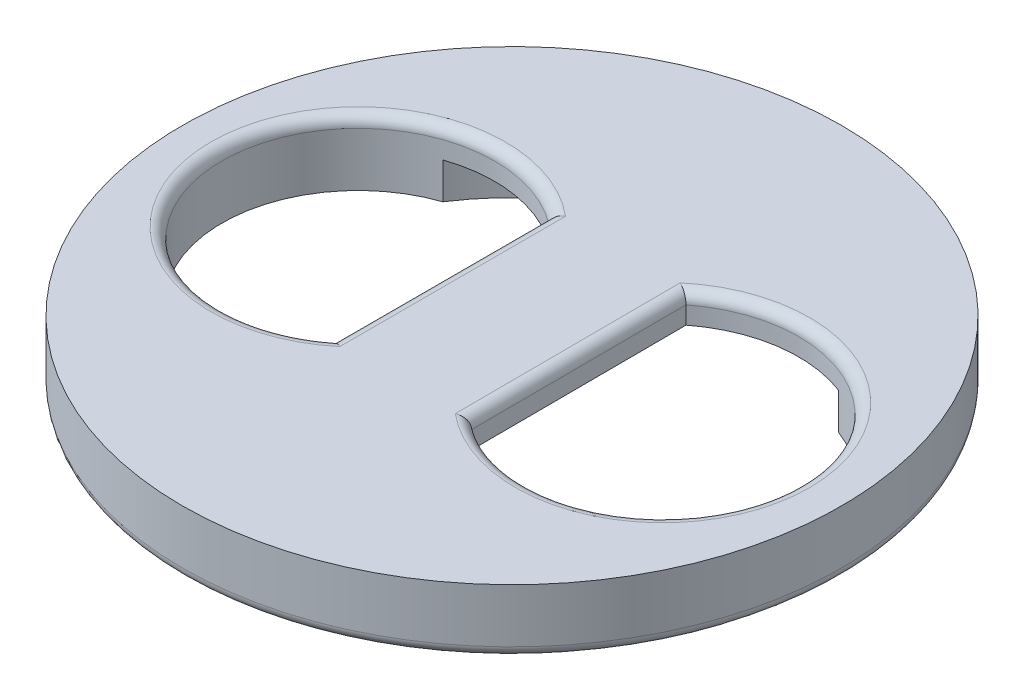
ISO-10303-21;
HEADER;
FILE_DESCRIPTION(('STEP AP214'),'2;1');
FILE_NAME('part.step','',(''),(''),'','','');
FILE_SCHEMA(('AUTOMOTIVE_DESIGN { 1 0 10303 214 1 1 1 1 }'));
ENDSEC;
DATA;
#1=APPLICATION_CONTEXT('core data for automotive mechanical design processes');
#2=APPLICATION_PROTOCOL_DEFINITION('international standard','automotive_design',2000,#1);
#3=PRODUCT_CONTEXT('',#1,'mechanical');
#4=PRODUCT('Part','Part','',(#3));
#5=PRODUCT_RELATED_PRODUCT_CATEGORY('part','',(#4));
#6=PRODUCT_DEFINITION_FORMATION('','',#4);
#7=PRODUCT_DEFINITION_CONTEXT('part definition',#1,'design');
#8=PRODUCT_DEFINITION('design','',#6,#7);
#9=PRODUCT_DEFINITION_SHAPE('','',#8);
#10=(LENGTH_UNIT() NAMED_UNIT(*) SI_UNIT(.MILLI.,.METRE.));
#11=(NAMED_UNIT(*) PLANE_ANGLE_UNIT() SI_UNIT($,.RADIAN.));
#12=(NAMED_UNIT(*) SI_UNIT($,.STERADIAN.) SOLID_ANGLE_UNIT());
#13=UNCERTAINTY_MEASURE_WITH_UNIT(LENGTH_MEASURE(1.E-05),#10,'distance_accuracy_value','');
#14=(GEOMETRIC_REPRESENTATION_CONTEXT(3) GLOBAL_UNCERTAINTY_ASSIGNED_CONTEXT((#13)) GLOBAL_UNIT_ASSIGNED_CONTEXT((#10,
#11,#12)) REPRESENTATION_CONTEXT('',''));
#15=CARTESIAN_POINT('',(0.,0.,0.));
#16=DIRECTION('',(0.,0.,1.));
#17=DIRECTION('',(1.,0.,0.));
#18=AXIS2_PLACEMENT_3D('',#15,#16,#17);
#19=CARTESIAN_POINT('',(0.,-1.65,0.));
#20=DIRECTION('',(0.,1.,0.));
#21=DIRECTION('',(0.,0.,1.));
#22=AXIS2_PLACEMENT_3D('',#19,#20,#21);
#23=CYLINDRICAL_SURFACE('',#22,10.75);
#24=DIRECTION('',(0.,1.,0.));
#25=VECTOR('',#24,1.);
#26=CARTESIAN_POINT('',(9.05340708676768,-5.,5.79640579335718));
#27=LINE('',#26,#25);
#28=CARTESIAN_POINT('',(9.05340708676768,0.,5.79640579335718));
#29=VERTEX_POINT('',#28);
#30=CARTESIAN_POINT('',(9.05340708676768,-1.15,5.79640579335718));
#31=VERTEX_POINT('',#30);
#32=EDGE_CURVE('E189',#29,#31,#27,.F.);
#33=ORIENTED_EDGE('',*,*,#32,.T.);
#34=CARTESIAN_POINT('',(0.,-1.15,0.));
#35=DIRECTION('',(0.,1.,0.));
#36=DIRECTION('',(0.,0.,1.));
#37=AXIS2_PLACEMENT_3D('',#34,#35,#36);
#38=CIRCLE('',#37,10.75);
#39=CARTESIAN_POINT('',(-9.00875,-1.15,5.86557102399247));
#40=VERTEX_POINT('',#39);
#41=EDGE_CURVE('E63',#31,#40,#38,.F.);
#42=ORIENTED_EDGE('',*,*,#41,.T.);
#43=DIRECTION('',(0.,1.,0.));
#44=VECTOR('',#43,1.);
#45=CARTESIAN_POINT('',(-9.00875,-5.,5.86557102399247));
#46=LINE('',#45,#44);
#47=CARTESIAN_POINT('',(-9.00875,0.,5.86557102399246));
#48=VERTEX_POINT('',#47);
#49=EDGE_CURVE('E129',#40,#48,#46,.T.);
#50=ORIENTED_EDGE('',*,*,#49,.T.);
#51=CARTESIAN_POINT('',(0.,0.,0.));
#52=DIRECTION('',(0.,1.,0.));
#53=DIRECTION('',(0.,0.,1.));
#54=AXIS2_PLACEMENT_3D('',#51,#52,#53);
#55=CIRCLE('',#54,10.75);
#56=EDGE_CURVE('E131',#48,#29,#55,.T.);
#57=ORIENTED_EDGE('',*,*,#56,.T.);
#58=EDGE_LOOP('',(#33,#42,#50,#57));
#59=FACE_BOUND('',#58,.T.);
#60=ADVANCED_FACE('F47',(#59),#23,.F.);
#61=CARTESIAN_POINT('',(0.,0.,0.));
#62=DIRECTION('',(0.,1.,0.));
#63=DIRECTION('',(0.,0.,1.));
#64=AXIS2_PLACEMENT_3D('',#61,#62,#63);
#65=PLANE('',#64);
#66=CARTESIAN_POINT('',(9.05339208250416,0.,-5.79642922845185));
#67=VERTEX_POINT('',#66);
#68=CARTESIAN_POINT('',(-9.00875,0.,-5.86557102399246));
#69=VERTEX_POINT('',#68);
#70=EDGE_CURVE('E151',#67,#69,#55,.T.);
#71=ORIENTED_EDGE('',*,*,#70,.F.);
#72=CARTESIAN_POINT('',(6.85304869461517,0.,-8.86969825135258E-06));
#73=DIRECTION('',(0.,1.,0.));
#74=DIRECTION('',(0.,0.,1.));
#75=AXIS2_PLACEMENT_3D('',#72,#73,#74);
#76=CIRCLE('',#75,6.2);
#77=CARTESIAN_POINT('',(3.03430788707781,0.,-4.88439405566065));
#78=VERTEX_POINT('',#77);
#79=EDGE_CURVE('E173',#67,#78,#76,.T.);
#80=ORIENTED_EDGE('',*,*,#79,.T.);
#81=DIRECTION('',(0.00383114386481541,0.,0.999992661141414));
#82=VECTOR('',#81,1.);
#83=CARTESIAN_POINT('',(3.05297602951723,0.,-0.0116964762236984));
#84=LINE('',#83,#82);
#85=CARTESIAN_POINT('',(3.07184527747778,0.,4.91349300963675));
#86=VERTEX_POINT('',#85);
#87=EDGE_CURVE('E176',#78,#86,#84,.T.);
#88=ORIENTED_EDGE('',*,*,#87,.T.);
#89=EDGE_CURVE('E149',#86,#29,#76,.T.);
#90=ORIENTED_EDGE('',*,*,#89,.T.);
#91=ORIENTED_EDGE('',*,*,#56,.F.);
#92=CARTESIAN_POINT('',(-7.,0.,0.));
#93=DIRECTION('',(0.,1.,0.));
#94=DIRECTION('',(0.,0.,1.));
#95=AXIS2_PLACEMENT_3D('',#92,#93,#94);
#96=CIRCLE('',#95,6.2);
#97=CARTESIAN_POINT('',(-3.2,0.,4.89897948556636));
#98=VERTEX_POINT('',#97);
#99=EDGE_CURVE('E145',#48,#98,#96,.T.);
#100=ORIENTED_EDGE('',*,*,#99,.T.);
#101=DIRECTION('',(0.,0.,1.));
#102=VECTOR('',#101,1.);
#103=CARTESIAN_POINT('',(-3.2,0.,0.));
#104=LINE('',#103,#102);
#105=CARTESIAN_POINT('',(-3.2,0.,-4.89897948556636));
#106=VERTEX_POINT('',#105);
#107=EDGE_CURVE('E164',#106,#98,#104,.T.);
#108=ORIENTED_EDGE('',*,*,#107,.F.);
#109=EDGE_CURVE('E158',#106,#69,#96,.T.);
#110=ORIENTED_EDGE('',*,*,#109,.T.);
#111=EDGE_LOOP('',(#71,#80,#88,#90,#91,#100,#108,#110));
#112=FACE_BOUND('',#111,.T.);
#113=ADVANCED_FACE('F143',(#112),#65,.F.);
#114=CARTESIAN_POINT('',(6.85304869461517,1.3,-8.86969825135258E-06));
#115=DIRECTION('',(0.,-1.,0.));
#116=DIRECTION('',(0.,0.,-1.));
#117=AXIS2_PLACEMENT_3D('',#114,#115,#116);
#118=CYLINDRICAL_SURFACE('',#117,6.2);
#119=CARTESIAN_POINT('',(6.85304869461517,-1.65,-8.86969825135258E-06));
#120=DIRECTION('',(0.,1.,0.));
#121=DIRECTION('',(0.,0.,1.));
#122=AXIS2_PLACEMENT_3D('',#119,#120,#121);
#123=CIRCLE('',#122,6.2);
#124=CARTESIAN_POINT('',(9.85596912070124,-1.65,5.42423936527358));
#125=VERTEX_POINT('',#124);
#126=CARTESIAN_POINT('',(9.05339208250416,-1.65,-5.79642922845185));
#127=VERTEX_POINT('',#126);
#128=EDGE_CURVE('E339',#125,#127,#123,.T.);
#129=ORIENTED_EDGE('',*,*,#128,.F.);
#130=CARTESIAN_POINT('',(9.85596912070124,-1.65,5.42423936527358));
#131=CARTESIAN_POINT('',(9.81906565745662,-1.649978552868,5.44467451056268));
#132=CARTESIAN_POINT('',(9.78192659495249,-1.64848144365552,5.46473814853227));
#133=CARTESIAN_POINT('',(9.70729413312632,-1.64221614377193,5.50408563489485));
#134=CARTESIAN_POINT('',(9.66979988918818,-1.6374327788301,5.52336542459347));
#135=CARTESIAN_POINT('',(9.5946090626536,-1.62421455204424,5.56107319393797));
#136=CARTESIAN_POINT('',(9.5569134134619,-1.61574946018966,5.57949269256432));
#137=CARTESIAN_POINT('',(9.48217277187068,-1.59467396993003,5.61509677567541));
#138=CARTESIAN_POINT('',(9.44512652325317,-1.58207279453482,5.63228400502115));
#139=CARTESIAN_POINT('',(9.38310562098239,-1.55645665345837,5.66034507392917));
#140=CARTESIAN_POINT('',(9.3577946082675,-1.54466102406926,5.67158532739129));
#141=CARTESIAN_POINT('',(9.3082526824164,-1.51833734767347,5.69320652151534));
#142=CARTESIAN_POINT('',(9.28402091864318,-1.50381150144544,5.70358814466451));
#143=CARTESIAN_POINT('',(9.23702473416689,-1.471500379439,5.7233916771146));
#144=CARTESIAN_POINT('',(9.21427494799814,-1.45368779111351,5.7328044302655));
#145=CARTESIAN_POINT('',(9.17145789151458,-1.41446878621799,5.75025285691824));
#146=CARTESIAN_POINT('',(9.15138676596727,-1.39306763684288,5.75829051431614));
#147=CARTESIAN_POINT('',(9.12139443032516,-1.35417211424408,5.77015380439106));
#148=CARTESIAN_POINT('',(9.11031386530098,-1.3377334255102,5.77449255988698));
#149=CARTESIAN_POINT('',(9.09064310486803,-1.30325323657476,5.78214308210522));
#150=CARTESIAN_POINT('',(9.08204470025078,-1.28521728376821,5.78545823675749));
#151=CARTESIAN_POINT('',(9.06810117559347,-1.24812815187572,5.79081155110013));
#152=CARTESIAN_POINT('',(9.06269624423141,-1.22910145601056,5.79287321072273));
#153=CARTESIAN_POINT('',(9.05530016503204,-1.19008044006851,5.7956873411566));
#154=CARTESIAN_POINT('',(9.05334989559439,-1.17007737430792,5.79642413660669));
#155=CARTESIAN_POINT('',(9.05340708676768,-1.15,5.79640579335718));
#156=B_SPLINE_CURVE_WITH_KNOTS('',3,(#130,#131,#132,#133,#134,#135,#136,#137,#138,#139,#140,
#141,#142,#143,#144,#145,#146,#147,#148,#149,#150,#151,#152,#153,#154,#155),.UNSPECIFIED.,.F.,
.F.,(4,2,2,2,2,2,2,2,2,2,2,2,4),(0.,0.12656349212286,0.253715353453612,0.381931550244175,
0.509863759678946,0.600045359418868,0.690154574755601,0.78104938788331,0.871811937461255,
0.932495881154862,0.99297676415169,1.0522856913977,1.11229183730601),.UNSPECIFIED.);
#157=EDGE_CURVE('E71',#125,#31,#156,.T.);
#158=ORIENTED_EDGE('',*,*,#157,.T.);
#159=ORIENTED_EDGE('',*,*,#32,.F.);
#160=ORIENTED_EDGE('',*,*,#89,.F.);
#161=DIRECTION('',(0.,-1.,0.));
#162=VECTOR('',#161,1.);
#163=CARTESIAN_POINT('',(3.07184527747778,1.3,4.91349300963675));
#164=LINE('',#163,#162);
#165=CARTESIAN_POINT('',(3.07184527747778,0.8,4.91349300963675));
#166=VERTEX_POINT('',#165);
#167=EDGE_CURVE('E152',#166,#86,#164,.T.);
#168=ORIENTED_EDGE('',*,*,#167,.F.);
#169=CARTESIAN_POINT('',(6.85304869461517,0.8,-8.86969825135258E-06));
#170=DIRECTION('',(0.,1.,0.));
#171=DIRECTION('',(0.,0.,1.));
#172=AXIS2_PLACEMENT_3D('',#169,#170,#171);
#173=CIRCLE('',#172,6.2);
#174=CARTESIAN_POINT('',(3.03430788707781,0.8,-4.88439405566065));
#175=VERTEX_POINT('',#174);
#176=EDGE_CURVE('E136',#166,#175,#173,.T.);
#177=ORIENTED_EDGE('',*,*,#176,.T.);
#178=DIRECTION('',(0.,-1.,0.));
#179=VECTOR('',#178,1.);
#180=CARTESIAN_POINT('',(3.03430788707781,1.3,-4.88439405566065));
#181=LINE('',#180,#179);
#182=EDGE_CURVE('E179',#175,#78,#181,.T.);
#183=ORIENTED_EDGE('',*,*,#182,.T.);
#184=ORIENTED_EDGE('',*,*,#79,.F.);
#185=DIRECTION('',(0.,1.,0.));
#186=VECTOR('',#185,1.);
#187=CARTESIAN_POINT('',(9.05339208250416,-5.,-5.79642922845185));
#188=LINE('',#187,#186);
#189=EDGE_CURVE('E192',#127,#67,#188,.T.);
#190=ORIENTED_EDGE('',*,*,#189,.F.);
#191=EDGE_LOOP('',(#129,#158,#159,#160,#168,#177,#183,#184,#190));
#192=FACE_BOUND('',#191,.T.);
#193=ADVANCED_FACE('F286',(#192),#118,.F.);
#194=CARTESIAN_POINT('',(-7.,1.3,0.));
#195=DIRECTION('',(0.,-1.,0.));
#196=DIRECTION('',(0.,0.,-1.));
#197=AXIS2_PLACEMENT_3D('',#194,#195,#196);
#198=CYLINDRICAL_SURFACE('',#197,6.2);
#199=ORIENTED_EDGE('',*,*,#49,.F.);
#200=CARTESIAN_POINT('',(-9.00875,-1.15,5.86557102399246));
#201=CARTESIAN_POINT('',(-9.0086913494197,-1.17071093627328,5.86558755188755));
#202=CARTESIAN_POINT('',(-9.01072210784418,-1.19134857779508,5.86489582039204));
#203=CARTESIAN_POINT('',(-9.01843482649226,-1.23161944764423,5.86224765828634));
#204=CARTESIAN_POINT('',(-9.02407610274457,-1.25126126820318,5.86030531831123));
#205=CARTESIAN_POINT('',(-9.03847378482948,-1.28909318962243,5.85531196997508));
#206=CARTESIAN_POINT('',(-9.04721761841519,-1.30728879188569,5.85226543500195));
#207=CARTESIAN_POINT('',(-9.06720511458799,-1.34209452261349,5.84523539215582));
#208=CARTESIAN_POINT('',(-9.07845607446457,-1.35869981635256,5.84124914714298));
#209=CARTESIAN_POINT('',(-9.10903376970439,-1.3981433275983,5.83029610284254));
#210=CARTESIAN_POINT('',(-9.12957214893977,-1.41990292422344,5.82283987224683));
#211=CARTESIAN_POINT('',(-9.1734624375594,-1.45974424947517,5.80660092981078));
#212=CARTESIAN_POINT('',(-9.1968196213966,-1.47781890762848,5.79781572320196));
#213=CARTESIAN_POINT('',(-9.25941646446917,-1.52021916237646,5.77379512150982));
#214=CARTESIAN_POINT('',(-9.30000896697664,-1.5420878415087,5.75777450639857));
#215=CARTESIAN_POINT('',(-9.38345725013597,-1.57911605099989,5.72373864938715));
#216=CARTESIAN_POINT('',(-9.42632212689798,-1.59424591424435,5.70571501559114));
#217=CARTESIAN_POINT('',(-9.4966329863645,-1.614149018766,5.67518231944217));
#218=CARTESIAN_POINT('',(-9.52381081646748,-1.62067700943114,5.6631505606217));
#219=CARTESIAN_POINT('',(-9.57834391606794,-1.63169198784302,5.63853148608519));
#220=CARTESIAN_POINT('',(-9.60569926059561,-1.6361780466307,5.62594392036067));
#221=CARTESIAN_POINT('',(-9.66003918371267,-1.64320691114826,5.60045349028855));
#222=CARTESIAN_POINT('',(-9.68702365059059,-1.64577576781636,5.58755740645997));
#223=CARTESIAN_POINT('',(-9.74086136032193,-1.64916846031961,5.56134676845183));
#224=CARTESIAN_POINT('',(-9.76771471866679,-1.64999430635092,5.54803271432568));
#225=CARTESIAN_POINT('',(-9.79446428571429,-1.65,5.53452521503582));
#226=B_SPLINE_CURVE_WITH_KNOTS('',3,(#200,#201,#202,#203,#204,#205,#206,#207,#208,#209,#210,
#211,#212,#213,#214,#215,#216,#217,#218,#219,#220,#221,#222,#223,#224,#225),.UNSPECIFIED.,.F.,
.F.,(4,2,2,2,2,2,2,2,2,2,2,2,4),(0.,0.061905826848654,0.123126083052598,0.184101042357775,
0.245255850076633,0.337244344376623,0.429407713974721,0.575039280539532,0.721305790413541,
0.812527493177671,0.903790655079809,0.993789952116103,1.08368539704715),.UNSPECIFIED.);
#227=CARTESIAN_POINT('',(-9.79446428571429,-1.65,5.53452521503583));
#228=VERTEX_POINT('',#227);
#229=EDGE_CURVE('E56',#40,#228,#226,.T.);
#230=ORIENTED_EDGE('',*,*,#229,.T.);
#231=CARTESIAN_POINT('',(-7.,-1.65,0.));
#232=DIRECTION('',(0.,1.,0.));
#233=DIRECTION('',(0.,0.,1.));
#234=AXIS2_PLACEMENT_3D('',#231,#232,#233);
#235=CIRCLE('',#234,6.2);
#236=CARTESIAN_POINT('',(-9.00874999999999,-1.65,-5.86557102399247));
#237=VERTEX_POINT('',#236);
#238=EDGE_CURVE('E166',#237,#228,#235,.T.);
#239=ORIENTED_EDGE('',*,*,#238,.F.);
#240=DIRECTION('',(0.,1.,0.));
#241=VECTOR('',#240,1.);
#242=CARTESIAN_POINT('',(-9.00875,-5.,-5.86557102399246));
#243=LINE('',#242,#241);
#244=EDGE_CURVE('E137',#69,#237,#243,.F.);
#245=ORIENTED_EDGE('',*,*,#244,.F.);
#246=ORIENTED_EDGE('',*,*,#109,.F.);
#247=DIRECTION('',(0.,-1.,0.));
#248=VECTOR('',#247,1.);
#249=CARTESIAN_POINT('',(-3.2,1.3,-4.89897948556636));
#250=LINE('',#249,#248);
#251=CARTESIAN_POINT('',(-3.2,0.8,-4.89897948556636));
#252=VERTEX_POINT('',#251);
#253=EDGE_CURVE('E182',#252,#106,#250,.T.);
#254=ORIENTED_EDGE('',*,*,#253,.F.);
#255=CARTESIAN_POINT('',(-7.,0.8,0.));
#256=DIRECTION('',(0.,1.,0.));
#257=DIRECTION('',(0.,0.,1.));
#258=AXIS2_PLACEMENT_3D('',#255,#256,#257);
#259=CIRCLE('',#258,6.2);
#260=CARTESIAN_POINT('',(-3.2,0.8,4.89897948556636));
#261=VERTEX_POINT('',#260);
#262=EDGE_CURVE('E222',#252,#261,#259,.T.);
#263=ORIENTED_EDGE('',*,*,#262,.T.);
#264=DIRECTION('',(0.,-1.,0.));
#265=VECTOR('',#264,1.);
#266=CARTESIAN_POINT('',(-3.2,1.3,4.89897948556636));
#267=LINE('',#266,#265);
#268=EDGE_CURVE('E156',#261,#98,#267,.T.);
#269=ORIENTED_EDGE('',*,*,#268,.T.);
#270=ORIENTED_EDGE('',*,*,#99,.F.);
#271=EDGE_LOOP('',(#199,#230,#239,#245,#246,#254,#263,#269,#270));
#272=FACE_BOUND('',#271,.T.);
#273=ADVANCED_FACE('F154',(#272),#198,.F.);
#274=CARTESIAN_POINT('',(3.05297602951723,1.3,-0.0116964762236984));
#275=DIRECTION('',(0.999992661141414,0.,-0.00383114386481541));
#276=DIRECTION('',(-0.00383114386481541,0.,-0.999992661141414));
#277=AXIS2_PLACEMENT_3D('',#274,#275,#276);
#278=PLANE('',#277);
#279=ORIENTED_EDGE('',*,*,#182,.F.);
#280=DIRECTION('',(0.00383114386481541,0.,0.999992661141414));
#281=VECTOR('',#280,1.);
#282=CARTESIAN_POINT('',(3.05297602951723,0.8,-0.0116964762236984));
#283=LINE('',#282,#281);
#284=EDGE_CURVE('E215',#175,#166,#283,.T.);
#285=ORIENTED_EDGE('',*,*,#284,.T.);
#286=ORIENTED_EDGE('',*,*,#167,.T.);
#287=ORIENTED_EDGE('',*,*,#87,.F.);
#288=EDGE_LOOP('',(#279,#285,#286,#287));
#289=FACE_BOUND('',#288,.T.);
#290=ADVANCED_FACE('F302',(#289),#278,.T.);
#291=CARTESIAN_POINT('',(-3.2,1.3,0.));
#292=DIRECTION('',(1.,0.,0.));
#293=DIRECTION('',(0.,0.,-1.));
#294=AXIS2_PLACEMENT_3D('',#291,#292,#293);
#295=PLANE('',#294);
#296=ORIENTED_EDGE('',*,*,#268,.F.);
#297=DIRECTION('',(0.,0.,1.));
#298=VECTOR('',#297,1.);
#299=CARTESIAN_POINT('',(-3.2,0.8,-4.89897948556636));
#300=LINE('',#299,#298);
#301=EDGE_CURVE('E218',#261,#252,#300,.F.);
#302=ORIENTED_EDGE('',*,*,#301,.T.);
#303=ORIENTED_EDGE('',*,*,#253,.T.);
#304=ORIENTED_EDGE('',*,*,#107,.T.);
#305=EDGE_LOOP('',(#296,#302,#303,#304));
#306=FACE_BOUND('',#305,.T.);
#307=ADVANCED_FACE('F303',(#306),#295,.F.);
#308=CARTESIAN_POINT('',(0.,1.3,0.));
#309=DIRECTION('',(0.,-1.,0.));
#310=DIRECTION('',(0.,0.,-1.));
#311=AXIS2_PLACEMENT_3D('',#308,#309,#310);
#312=CYLINDRICAL_SURFACE('',#311,15.);
#313=CARTESIAN_POINT('',(0.,-1.15,0.));
#314=DIRECTION('',(0.,1.,0.));
#315=DIRECTION('',(0.,0.,1.));
#316=AXIS2_PLACEMENT_3D('',#313,#314,#315);
#317=CIRCLE('',#316,15.);
#318=CARTESIAN_POINT('',(0.,-1.15,15.));
#319=VERTEX_POINT('',#318);
#320=EDGE_CURVE('E12',#319,#319,#317,.T.);
#321=ORIENTED_EDGE('',*,*,#320,.T.);
#322=EDGE_LOOP('',(#321));
#323=FACE_BOUND('',#322,.T.);
#324=CARTESIAN_POINT('',(0.,1.3,0.));
#325=DIRECTION('',(0.,1.,0.));
#326=DIRECTION('',(0.,0.,1.));
#327=AXIS2_PLACEMENT_3D('',#324,#325,#326);
#328=CIRCLE('',#327,15.);
#329=CARTESIAN_POINT('',(0.,1.3,15.));
#330=VERTEX_POINT('',#329);
#331=EDGE_CURVE('E170',#330,#330,#328,.T.);
#332=ORIENTED_EDGE('',*,*,#331,.F.);
#333=EDGE_LOOP('',(#332));
#334=FACE_BOUND('',#333,.T.);
#335=ADVANCED_FACE('F305',(#323,#334),#312,.T.);
#336=CARTESIAN_POINT('',(0.,1.3,0.));
#337=DIRECTION('',(0.,1.,0.));
#338=DIRECTION('',(0.,0.,1.));
#339=AXIS2_PLACEMENT_3D('',#336,#337,#338);
#340=PLANE('',#339);
#341=DIRECTION('',(0.00383114386481541,0.,0.999992661141414));
#342=VECTOR('',#341,1.);
#343=CARTESIAN_POINT('',(2.55297969894652,1.3,-0.00978090429129071));
#344=LINE('',#343,#342);
#345=CARTESIAN_POINT('',(2.57276502530144,1.3,5.15452037264838));
#346=VERTEX_POINT('',#345);
#347=CARTESIAN_POINT('',(2.53339547811274,1.3,-5.12159027480747));
#348=VERTEX_POINT('',#347);
#349=EDGE_CURVE('E208',#346,#348,#344,.F.);
#350=ORIENTED_EDGE('',*,*,#349,.T.);
#351=CARTESIAN_POINT('',(6.85304869461517,1.3,-8.86969825135258E-06));
#352=DIRECTION('',(0.,1.,0.));
#353=DIRECTION('',(0.,0.,1.));
#354=AXIS2_PLACEMENT_3D('',#351,#352,#353);
#355=CIRCLE('',#354,6.7);
#356=EDGE_CURVE('E211',#348,#346,#355,.F.);
#357=ORIENTED_EDGE('',*,*,#356,.T.);
#358=EDGE_LOOP('',(#350,#357));
#359=FACE_BOUND('',#358,.T.);
#360=CARTESIAN_POINT('',(-7.,1.3,0.));
#361=DIRECTION('',(0.,1.,0.));
#362=DIRECTION('',(0.,0.,1.));
#363=AXIS2_PLACEMENT_3D('',#360,#361,#362);
#364=CIRCLE('',#363,6.7);
#365=CARTESIAN_POINT('',(-2.70000000000004,1.3,5.13809303146608));
#366=VERTEX_POINT('',#365);
#367=CARTESIAN_POINT('',(-2.70000000000004,1.3,-5.13809303146608));
#368=VERTEX_POINT('',#367);
#369=EDGE_CURVE('E201',#366,#368,#364,.F.);
#370=ORIENTED_EDGE('',*,*,#369,.T.);
#371=DIRECTION('',(0.,0.,1.));
#372=VECTOR('',#371,1.);
#373=CARTESIAN_POINT('',(-2.7,1.3,4.89897948556636));
#374=LINE('',#373,#372);
#375=EDGE_CURVE('E204',#368,#366,#374,.T.);
#376=ORIENTED_EDGE('',*,*,#375,.T.);
#377=EDGE_LOOP('',(#370,#376));
#378=FACE_BOUND('',#377,.T.);
#379=ORIENTED_EDGE('',*,*,#331,.T.);
#380=EDGE_LOOP('',(#379));
#381=FACE_BOUND('',#380,.T.);
#382=ADVANCED_FACE('F311',(#359,#378,#381),#340,.T.);
#383=CARTESIAN_POINT('',(0.,-1.65,0.));
#384=DIRECTION('',(0.,1.,0.));
#385=DIRECTION('',(0.,0.,1.));
#386=AXIS2_PLACEMENT_3D('',#383,#384,#385);
#387=PLANE('',#386);
#388=CARTESIAN_POINT('',(0.,-1.65,0.));
#389=DIRECTION('',(0.,1.,0.));
#390=DIRECTION('',(0.,0.,1.));
#391=AXIS2_PLACEMENT_3D('',#388,#389,#390);
#392=CIRCLE('',#391,14.5);
#393=CARTESIAN_POINT('',(0.,-1.65,14.5));
#394=VERTEX_POINT('',#393);
#395=EDGE_CURVE('E225',#394,#394,#392,.F.);
#396=ORIENTED_EDGE('',*,*,#395,.T.);
#397=EDGE_LOOP('',(#396));
#398=FACE_BOUND('',#397,.T.);
#399=ORIENTED_EDGE('',*,*,#238,.T.);
#400=CARTESIAN_POINT('',(0.,-1.65,0.));
#401=DIRECTION('',(0.,1.,0.));
#402=DIRECTION('',(0.,0.,1.));
#403=AXIS2_PLACEMENT_3D('',#400,#401,#402);
#404=CIRCLE('',#403,11.25);
#405=EDGE_CURVE('E275',#228,#125,#404,.T.);
#406=ORIENTED_EDGE('',*,*,#405,.T.);
#407=ORIENTED_EDGE('',*,*,#128,.T.);
#408=CARTESIAN_POINT('',(0.,-1.65,0.));
#409=DIRECTION('',(0.,1.,0.));
#410=DIRECTION('',(0.,0.,1.));
#411=AXIS2_PLACEMENT_3D('',#408,#409,#410);
#412=CIRCLE('',#411,10.75);
#413=EDGE_CURVE('E159',#127,#237,#412,.T.);
#414=ORIENTED_EDGE('',*,*,#413,.T.);
#415=EDGE_LOOP('',(#399,#406,#407,#414));
#416=FACE_BOUND('',#415,.T.);
#417=ADVANCED_FACE('F323',(#398,#416),#387,.F.);
#418=ORIENTED_EDGE('',*,*,#70,.T.);
#419=ORIENTED_EDGE('',*,*,#244,.T.);
#420=ORIENTED_EDGE('',*,*,#413,.F.);
#421=ORIENTED_EDGE('',*,*,#189,.T.);
#422=EDGE_LOOP('',(#418,#419,#420,#421));
#423=FACE_BOUND('',#422,.T.);
#424=ADVANCED_FACE('F249',(#423),#23,.F.);
#425=CARTESIAN_POINT('',(2.55297969894652,0.8,-0.0097809042912907));
#426=DIRECTION('',(0.00383114386481541,0.,0.999992661141414));
#427=DIRECTION('',(0.999992661141414,0.,-0.00383114386481541));
#428=AXIS2_PLACEMENT_3D('',#425,#426,#427);
#429=CYLINDRICAL_SURFACE('',#428,0.5);
#430=CARTESIAN_POINT('',(3.03430788707781,0.8,-4.88439405566065));
#431=CARTESIAN_POINT('',(3.03433939404698,0.826102334739123,-4.88437761964569));
#432=CARTESIAN_POINT('',(3.03226231518027,0.852180271927774,-4.88538647898086));
#433=CARTESIAN_POINT('',(3.02414281121009,0.903470826820076,-4.88932388910898));
#434=CARTESIAN_POINT('',(3.01811448960188,0.928686187818752,-4.89224561211863));
#435=CARTESIAN_POINT('',(3.00234564127799,0.977616683267055,-4.89987733274801));
#436=CARTESIAN_POINT('',(2.99260723660782,1.00133266628737,-4.90458630811238));
#437=CARTESIAN_POINT('',(2.96981647524967,1.04672317318754,-4.91558492229352));
#438=CARTESIAN_POINT('',(2.95676211299947,1.06839645067984,-4.92187551768446));
#439=CARTESIAN_POINT('',(2.92719039529996,1.11010823176348,-4.93609159066058));
#440=CARTESIAN_POINT('',(2.9105508893945,1.13004023305954,-4.94407451167401));
#441=CARTESIAN_POINT('',(2.87471196928217,1.16685583079945,-4.9612197457831));
#442=CARTESIAN_POINT('',(2.85551175529269,1.18373847094597,-4.97038242732078));
#443=CARTESIAN_POINT('',(2.8131239891781,1.21569540823753,-4.99054794827855));
#444=CARTESIAN_POINT('',(2.78973045966888,1.23043804876967,-5.0016430368473));
#445=CARTESIAN_POINT('',(2.74114128591241,1.25579153940716,-5.02460442484658));
#446=CARTESIAN_POINT('',(2.71594457224557,1.26639991314776,-5.03647118154509));
#447=CARTESIAN_POINT('',(2.66551711393526,1.28298844263197,-5.06013211432997));
#448=CARTESIAN_POINT('',(2.64033662302693,1.28915166199936,-5.07190652048167));
#449=CARTESIAN_POINT('',(2.58944629510241,1.29752377557383,-5.09561730851466));
#450=CARTESIAN_POINT('',(2.56373767000202,1.29974088010001,-5.10755330190185));
#451=CARTESIAN_POINT('',(2.53648547112851,1.29999287927451,-5.12016118646466));
#452=CARTESIAN_POINT('',(2.53494044034285,1.3000000162011,-5.12087582286497));
#453=CARTESIAN_POINT('',(2.53339547811274,1.3,-5.12159027480744));
#454=B_SPLINE_CURVE_WITH_KNOTS('',3,(#430,#431,#432,#433,#434,#435,#436,#437,#438,#439,#440,
#441,#442,#443,#444,#445,#446,#447,#448,#449,#450,#451,#452,#453),.UNSPECIFIED.,.F.,.F.,(4,2,2,
2,2,2,2,2,2,2,2,4),(0.,0.0781669270653759,0.156056354867521,0.233901299200554,0.311793438399553,
0.392948252527355,0.474128473252208,0.563141562168992,0.652207886963316,0.737356261475017,
0.822327267559419,0.82743414263946),.UNSPECIFIED.);
#455=EDGE_CURVE('E226',#348,#175,#454,.F.);
#456=ORIENTED_EDGE('',*,*,#455,.F.);
#457=ORIENTED_EDGE('',*,*,#349,.F.);
#458=CARTESIAN_POINT('',(3.07184527747778,0.8,4.91349300963675));
#459=CARTESIAN_POINT('',(3.0718766575855,0.826102334739123,4.91347633269058));
#460=CARTESIAN_POINT('',(3.06980736980589,0.852180271927774,4.91450107746947));
#461=CARTESIAN_POINT('',(3.0617182735343,0.903470826820076,4.91850058553269));
#462=CARTESIAN_POINT('',(3.05571251580751,0.928686187818752,4.92146841316991));
#463=CARTESIAN_POINT('',(3.0400026063935,0.977616683267055,4.92922073433393));
#464=CARTESIAN_POINT('',(3.03030056885674,1.00133266628737,4.93400418937579));
#465=CARTESIAN_POINT('',(3.00759475045683,1.04672317318754,4.94517710877854));
#466=CARTESIAN_POINT('',(2.99458897141985,1.06839645067984,4.95156754505261));
#467=CARTESIAN_POINT('',(2.96512704864989,1.11010823176348,4.96600978605805));
#468=CARTESIAN_POINT('',(2.94854919819138,1.13004023305954,4.97411996847648));
#469=CARTESIAN_POINT('',(2.91284270089509,1.16685583079944,4.99153930538413));
#470=CARTESIAN_POINT('',(2.89371325712123,1.18373847094597,5.00084883443268));
#471=CARTESIAN_POINT('',(2.8514812482032,1.21569540823753,5.02133854830161));
#472=CARTESIAN_POINT('',(2.82817341855578,1.23043804876967,5.03261255780905));
#473=CARTESIAN_POINT('',(2.77976160662072,1.25579153940716,5.05594557326687));
#474=CARTESIAN_POINT('',(2.75465655844858,1.26639991314776,5.06800504466594));
#475=CARTESIAN_POINT('',(2.70441187599722,1.28298844263197,5.09205166973579));
#476=CARTESIAN_POINT('',(2.6793223424961,1.28915166199936,5.10401866899649));
#477=CARTESIAN_POINT('',(2.62861518602067,1.29752377557383,5.12811869446512));
#478=CARTESIAN_POINT('',(2.60299877194987,1.29974088010001,5.14025132290436));
#479=CARTESIAN_POINT('',(2.57584397760375,1.29999287927451,5.15306765001512));
#480=CARTESIAN_POINT('',(2.5743044678825,1.3000000162011,5.1537941038206));
#481=CARTESIAN_POINT('',(2.57276502530144,1.3,5.15452037264835));
#482=B_SPLINE_CURVE_WITH_KNOTS('',3,(#458,#459,#460,#461,#462,#463,#464,#465,#466,#467,#468,
#469,#470,#471,#472,#473,#474,#475,#476,#477,#478,#479,#480,#481),.UNSPECIFIED.,.F.,.F.,(4,2,2,
2,2,2,2,2,2,2,2,4),(0.,0.0781669270653759,0.156056354867521,0.233901299200553,0.311793438399553,
0.392948252527355,0.474128473252208,0.563141562168992,0.652207886963316,0.737356261475018,
0.82232726755942,0.827434142639461),.UNSPECIFIED.);
#483=EDGE_CURVE('E235',#166,#346,#482,.T.);
#484=ORIENTED_EDGE('',*,*,#483,.F.);
#485=ORIENTED_EDGE('',*,*,#284,.F.);
#486=EDGE_LOOP('',(#456,#457,#484,#485));
#487=FACE_BOUND('',#486,.T.);
#488=ADVANCED_FACE('F245',(#487),#429,.T.);
#489=CARTESIAN_POINT('',(6.85304869461517,0.8,-8.86969825135258E-06));
#490=DIRECTION('',(0.,1.,0.));
#491=DIRECTION('',(0.,0.,1.));
#492=AXIS2_PLACEMENT_3D('',#489,#490,#491);
#493=TOROIDAL_SURFACE('',#492,6.7,0.5);
#494=ORIENTED_EDGE('',*,*,#483,.T.);
#495=ORIENTED_EDGE('',*,*,#356,.F.);
#496=ORIENTED_EDGE('',*,*,#455,.T.);
#497=ORIENTED_EDGE('',*,*,#176,.F.);
#498=EDGE_LOOP('',(#494,#495,#496,#497));
#499=FACE_BOUND('',#498,.T.);
#500=ADVANCED_FACE('F242',(#499),#493,.T.);
#501=CARTESIAN_POINT('',(-7.,0.8,0.));
#502=DIRECTION('',(0.,1.,0.));
#503=DIRECTION('',(0.,0.,1.));
#504=AXIS2_PLACEMENT_3D('',#501,#502,#503);
#505=TOROIDAL_SURFACE('',#504,6.7,0.5);
#506=CARTESIAN_POINT('',(-3.2,0.8,4.89897948556636));
#507=CARTESIAN_POINT('',(-3.2000314437692,0.826102334739123,4.89896292896428));
#508=CARTESIAN_POINT('',(-3.19795824523113,0.852180271927774,4.89997973848353));
#509=CARTESIAN_POINT('',(-3.1898538856335,0.903470826820076,4.90394822670338));
#510=CARTESIAN_POINT('',(-3.18383680180747,0.928686187818752,4.90689302363826));
#511=CARTESIAN_POINT('',(-3.1680973074286,0.977616683267055,4.91458510098603));
#512=CARTESIAN_POINT('',(-3.15837701498928,1.00133266628738,4.9193313510212));
#513=CARTESIAN_POINT('',(-3.13562855816255,1.04672317318754,4.93041719917062));
#514=CARTESIAN_POINT('',(-3.12259839189241,1.06839645067984,4.93675776153562));
#515=CARTESIAN_POINT('',(-3.09308135503631,1.11010823176348,4.95108702368682));
#516=CARTESIAN_POINT('',(-3.07647255496469,1.13004023305954,4.95913363445569));
#517=CARTESIAN_POINT('',(-3.0406995837276,1.16685583079945,4.97641604679724));
#518=CARTESIAN_POINT('',(-3.02153461419694,1.18373847094597,4.98565221987332));
#519=CARTESIAN_POINT('',(-2.97922441617207,1.21569540823753,5.00597998646928));
#520=CARTESIAN_POINT('',(-2.95587356522515,1.23043804876967,5.0171646175898));
#521=CARTESIAN_POINT('',(-2.90737271643851,1.25579153940716,5.04031198919364));
#522=CARTESIAN_POINT('',(-2.88222165093891,1.26639991314776,5.05227519103867));
#523=CARTESIAN_POINT('',(-2.83188521114607,1.28298844263197,5.07612914502683));
#524=CARTESIAN_POINT('',(-2.80675001447768,1.28915166199936,5.08799993485109));
#525=CARTESIAN_POINT('',(-2.75595089947019,1.29752377557383,5.11190551704157));
#526=CARTESIAN_POINT('',(-2.7302881915496,1.29974088010001,5.12393991627353));
#527=CARTESIAN_POINT('',(-2.70308449529571,1.29999287927451,5.13665211540336));
#528=CARTESIAN_POINT('',(-2.70154221372368,1.3000000162011,5.13737266579428));
#529=CARTESIAN_POINT('',(-2.7,1.3,5.13809303146605));
#530=B_SPLINE_CURVE_WITH_KNOTS('',3,(#506,#507,#508,#509,#510,#511,#512,#513,#514,#515,#516,
#517,#518,#519,#520,#521,#522,#523,#524,#525,#526,#527,#528,#529),.UNSPECIFIED.,.F.,.F.,(4,2,2,
2,2,2,2,2,2,2,2,4),(0.,0.078166927065376,0.156056354867521,0.233901299200554,0.311793438399553,
0.392948252527355,0.474128473252209,0.563141562168993,0.652207886963317,0.737356261475016,
0.822327267559418,0.827434142639459),.UNSPECIFIED.);
#531=EDGE_CURVE('E260',#261,#366,#530,.T.);
#532=ORIENTED_EDGE('',*,*,#531,.F.);
#533=ORIENTED_EDGE('',*,*,#262,.F.);
#534=CARTESIAN_POINT('',(-3.2,0.8,-4.89897948556636));
#535=CARTESIAN_POINT('',(-3.2000314437692,0.826102334739124,-4.89896292896428));
#536=CARTESIAN_POINT('',(-3.19795824523113,0.852180271927774,-4.89997973848353));
#537=CARTESIAN_POINT('',(-3.1898538856335,0.903470826820076,-4.90394822670338));
#538=CARTESIAN_POINT('',(-3.18383680180747,0.928686187818752,-4.90689302363826));
#539=CARTESIAN_POINT('',(-3.1680973074286,0.977616683267055,-4.91458510098603));
#540=CARTESIAN_POINT('',(-3.15837701498928,1.00133266628738,-4.9193313510212));
#541=CARTESIAN_POINT('',(-3.13562855816255,1.04672317318754,-4.93041719917062));
#542=CARTESIAN_POINT('',(-3.12259839189241,1.06839645067984,-4.93675776153562));
#543=CARTESIAN_POINT('',(-3.09308135503631,1.11010823176348,-4.95108702368682));
#544=CARTESIAN_POINT('',(-3.07647255496469,1.13004023305954,-4.95913363445569));
#545=CARTESIAN_POINT('',(-3.04069958372761,1.16685583079945,-4.97641604679724));
#546=CARTESIAN_POINT('',(-3.02153461419694,1.18373847094597,-4.98565221987332));
#547=CARTESIAN_POINT('',(-2.97922441617207,1.21569540823753,-5.00597998646928));
#548=CARTESIAN_POINT('',(-2.95587356522515,1.23043804876967,-5.0171646175898));
#549=CARTESIAN_POINT('',(-2.90737271643851,1.25579153940716,-5.04031198919364));
#550=CARTESIAN_POINT('',(-2.88222165093891,1.26639991314776,-5.05227519103867));
#551=CARTESIAN_POINT('',(-2.83188521114607,1.28298844263197,-5.07612914502683));
#552=CARTESIAN_POINT('',(-2.80675001447768,1.28915166199936,-5.08799993485108));
#553=CARTESIAN_POINT('',(-2.75595089947019,1.29752377557383,-5.11190551704158));
#554=CARTESIAN_POINT('',(-2.73028819154961,1.29974088010001,-5.12393991627355));
#555=CARTESIAN_POINT('',(-2.70308449529572,1.29999287927451,-5.13665211540336));
#556=CARTESIAN_POINT('',(-2.70154221372368,1.3000000162011,-5.13737266579428));
#557=CARTESIAN_POINT('',(-2.7,1.3,-5.13809303146605));
#558=B_SPLINE_CURVE_WITH_KNOTS('',3,(#534,#535,#536,#537,#538,#539,#540,#541,#542,#543,#544,
#545,#546,#547,#548,#549,#550,#551,#552,#553,#554,#555,#556,#557),.UNSPECIFIED.,.F.,.F.,(4,2,2,
2,2,2,2,2,2,2,2,4),(0.,0.078166927065376,0.156056354867521,0.233901299200554,0.311793438399554,
0.392948252527356,0.474128473252209,0.563141562168993,0.652207886963317,0.737356261475016,
0.822327267559418,0.827434142639459),.UNSPECIFIED.);
#559=EDGE_CURVE('E236',#368,#252,#558,.F.);
#560=ORIENTED_EDGE('',*,*,#559,.F.);
#561=ORIENTED_EDGE('',*,*,#369,.F.);
#562=EDGE_LOOP('',(#532,#533,#560,#561));
#563=FACE_BOUND('',#562,.T.);
#564=ADVANCED_FACE('F251',(#563),#505,.T.);
#565=CARTESIAN_POINT('',(-2.7,0.8,0.));
#566=DIRECTION('',(0.,0.,-1.));
#567=DIRECTION('',(-1.,0.,0.));
#568=AXIS2_PLACEMENT_3D('',#565,#566,#567);
#569=CYLINDRICAL_SURFACE('',#568,0.5);
#570=ORIENTED_EDGE('',*,*,#559,.T.);
#571=ORIENTED_EDGE('',*,*,#301,.F.);
#572=ORIENTED_EDGE('',*,*,#531,.T.);
#573=ORIENTED_EDGE('',*,*,#375,.F.);
#574=EDGE_LOOP('',(#570,#571,#572,#573));
#575=FACE_BOUND('',#574,.T.);
#576=ADVANCED_FACE('F256',(#575),#569,.T.);
#577=CARTESIAN_POINT('',(0.,-1.15,0.));
#578=DIRECTION('',(0.,1.,0.));
#579=DIRECTION('',(0.,0.,1.));
#580=AXIS2_PLACEMENT_3D('',#577,#578,#579);
#581=TOROIDAL_SURFACE('',#580,11.25,0.5);
#582=ORIENTED_EDGE('',*,*,#229,.F.);
#583=ORIENTED_EDGE('',*,*,#41,.F.);
#584=ORIENTED_EDGE('',*,*,#157,.F.);
#585=ORIENTED_EDGE('',*,*,#405,.F.);
#586=EDGE_LOOP('',(#582,#583,#584,#585));
#587=FACE_BOUND('',#586,.T.);
#588=ADVANCED_FACE('F290',(#587),#581,.T.);
#589=CARTESIAN_POINT('',(0.,-1.15,0.));
#590=DIRECTION('',(0.,1.,0.));
#591=DIRECTION('',(0.,0.,1.));
#592=AXIS2_PLACEMENT_3D('',#589,#590,#591);
#593=TOROIDAL_SURFACE('',#592,14.5,0.5);
#594=ORIENTED_EDGE('',*,*,#395,.F.);
#595=EDGE_LOOP('',(#594));
#596=FACE_BOUND('',#595,.T.);
#597=ORIENTED_EDGE('',*,*,#320,.F.);
#598=EDGE_LOOP('',(#597));
#599=FACE_BOUND('',#598,.T.);
#600=ADVANCED_FACE('F49',(#596,#599),#593,.T.);
#601=CLOSED_SHELL('',(#60,#113,#193,#273,#290,#307,#335,#382,#417,#424,#488,#500,#564,#576,#588,#600));
#602=MANIFOLD_SOLID_BREP('B2',#601);
#603=ADVANCED_BREP_SHAPE_REPRESENTATION('',(#18,#602),#14);
#604=SHAPE_DEFINITION_REPRESENTATION(#9,#603);
ENDSEC;
END-ISO-10303-21;
